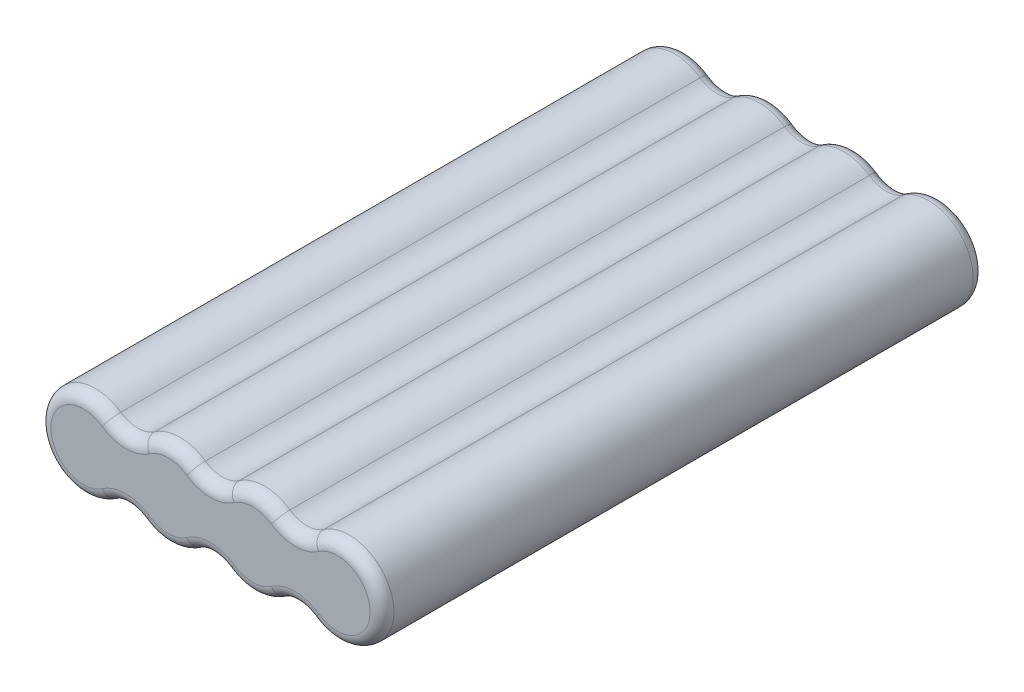
ISO-10303-21;
HEADER;
FILE_DESCRIPTION(('STEP AP214'),'2;1');
FILE_NAME('part.step','',(''),(''),'','','');
FILE_SCHEMA(('AUTOMOTIVE_DESIGN { 1 0 10303 214 1 1 1 1 }'));
ENDSEC;
DATA;
#1=APPLICATION_CONTEXT('core data for automotive mechanical design processes');
#2=APPLICATION_PROTOCOL_DEFINITION('international standard','automotive_design',2000,#1);
#3=PRODUCT_CONTEXT('',#1,'mechanical');
#4=PRODUCT('Part','Part','',(#3));
#5=PRODUCT_RELATED_PRODUCT_CATEGORY('part','',(#4));
#6=PRODUCT_DEFINITION_FORMATION('','',#4);
#7=PRODUCT_DEFINITION_CONTEXT('part definition',#1,'design');
#8=PRODUCT_DEFINITION('design','',#6,#7);
#9=PRODUCT_DEFINITION_SHAPE('','',#8);
#10=(LENGTH_UNIT() NAMED_UNIT(*) SI_UNIT(.MILLI.,.METRE.));
#11=(NAMED_UNIT(*) PLANE_ANGLE_UNIT() SI_UNIT($,.RADIAN.));
#12=(NAMED_UNIT(*) SI_UNIT($,.STERADIAN.) SOLID_ANGLE_UNIT());
#13=UNCERTAINTY_MEASURE_WITH_UNIT(LENGTH_MEASURE(1.E-05),#10,'distance_accuracy_value','');
#14=(GEOMETRIC_REPRESENTATION_CONTEXT(3) GLOBAL_UNCERTAINTY_ASSIGNED_CONTEXT((#13)) GLOBAL_UNIT_ASSIGNED_CONTEXT((#10,
#11,#12)) REPRESENTATION_CONTEXT('',''));
#15=CARTESIAN_POINT('',(0.,0.,0.));
#16=DIRECTION('',(0.,0.,1.));
#17=DIRECTION('',(1.,0.,0.));
#18=AXIS2_PLACEMENT_3D('',#15,#16,#17);
#19=CARTESIAN_POINT('',(14.2193333333333,-10.2811789153233,50.673));
#20=DIRECTION('',(0.,0.,-1.));
#21=DIRECTION('',(-1.,0.,0.));
#22=AXIS2_PLACEMENT_3D('',#19,#20,#21);
#23=CYLINDRICAL_SURFACE('',#22,5.);
#24=DIRECTION('',(0.,0.,-1.));
#25=VECTOR('',#24,1.);
#26=CARTESIAN_POINT('',(11.3754666666667,-6.16870734919399,50.673));
#27=LINE('',#26,#25);
#28=CARTESIAN_POINT('',(11.3754666666667,-6.16870734919399,48.673));
#29=VERTEX_POINT('',#28);
#30=CARTESIAN_POINT('',(11.3754666666667,-6.16870734919399,-48.673));
#31=VERTEX_POINT('',#30);
#32=EDGE_CURVE('E470',#29,#31,#27,.T.);
#33=ORIENTED_EDGE('',*,*,#32,.T.);
#34=CARTESIAN_POINT('',(14.2193333333333,-10.2811789153233,-48.673));
#35=DIRECTION('',(0.,0.,1.));
#36=DIRECTION('',(1.,0.,0.));
#37=AXIS2_PLACEMENT_3D('',#34,#35,#36);
#38=CIRCLE('',#37,5.);
#39=CARTESIAN_POINT('',(17.0632,-6.16870734919399,-48.673));
#40=VERTEX_POINT('',#39);
#41=EDGE_CURVE('E393',#31,#40,#38,.F.);
#42=ORIENTED_EDGE('',*,*,#41,.T.);
#43=DIRECTION('',(0.,0.,-1.));
#44=VECTOR('',#43,1.);
#45=CARTESIAN_POINT('',(17.0632,-6.16870734919399,50.673));
#46=LINE('',#45,#44);
#47=CARTESIAN_POINT('',(17.0632,-6.16870734919399,48.673));
#48=VERTEX_POINT('',#47);
#49=EDGE_CURVE('E273',#48,#40,#46,.T.);
#50=ORIENTED_EDGE('',*,*,#49,.F.);
#51=CARTESIAN_POINT('',(14.2193333333333,-10.2811789153233,48.673));
#52=DIRECTION('',(0.,0.,1.));
#53=DIRECTION('',(1.,0.,0.));
#54=AXIS2_PLACEMENT_3D('',#51,#52,#53);
#55=CIRCLE('',#54,5.);
#56=EDGE_CURVE('E391',#48,#29,#55,.T.);
#57=ORIENTED_EDGE('',*,*,#56,.T.);
#58=EDGE_LOOP('',(#33,#42,#50,#57));
#59=FACE_BOUND('',#58,.T.);
#60=ADVANCED_FACE('F44',(#59),#23,.F.);
#61=CARTESIAN_POINT('',(21.329,0.,50.673));
#62=DIRECTION('',(0.,0.,-1.));
#63=DIRECTION('',(-1.,0.,0.));
#64=AXIS2_PLACEMENT_3D('',#61,#62,#63);
#65=CYLINDRICAL_SURFACE('',#64,7.5);
#66=ORIENTED_EDGE('',*,*,#49,.T.);
#67=CARTESIAN_POINT('',(21.329,0.,-48.673));
#68=DIRECTION('',(0.,0.,1.));
#69=DIRECTION('',(1.,0.,0.));
#70=AXIS2_PLACEMENT_3D('',#67,#68,#69);
#71=CIRCLE('',#70,7.5);
#72=CARTESIAN_POINT('',(17.0632,6.168707349194,-48.673));
#73=VERTEX_POINT('',#72);
#74=EDGE_CURVE('E271',#40,#73,#71,.T.);
#75=ORIENTED_EDGE('',*,*,#74,.T.);
#76=DIRECTION('',(0.,0.,-1.));
#77=VECTOR('',#76,1.);
#78=CARTESIAN_POINT('',(17.0632,6.168707349194,50.673));
#79=LINE('',#78,#77);
#80=CARTESIAN_POINT('',(17.0632,6.168707349194,48.673));
#81=VERTEX_POINT('',#80);
#82=EDGE_CURVE('E252',#81,#73,#79,.T.);
#83=ORIENTED_EDGE('',*,*,#82,.F.);
#84=CARTESIAN_POINT('',(21.329,0.,48.673));
#85=DIRECTION('',(0.,0.,1.));
#86=DIRECTION('',(1.,0.,0.));
#87=AXIS2_PLACEMENT_3D('',#84,#85,#86);
#88=CIRCLE('',#87,7.5);
#89=EDGE_CURVE('E268',#81,#48,#88,.F.);
#90=ORIENTED_EDGE('',*,*,#89,.T.);
#91=EDGE_LOOP('',(#66,#75,#83,#90));
#92=FACE_BOUND('',#91,.T.);
#93=ADVANCED_FACE('F266',(#92),#65,.T.);
#94=CARTESIAN_POINT('',(14.2193333333333,10.2811789153233,50.673));
#95=DIRECTION('',(0.,0.,-1.));
#96=DIRECTION('',(-1.,0.,0.));
#97=AXIS2_PLACEMENT_3D('',#94,#95,#96);
#98=CYLINDRICAL_SURFACE('',#97,5.);
#99=ORIENTED_EDGE('',*,*,#82,.T.);
#100=CARTESIAN_POINT('',(14.2193333333333,10.2811789153233,-48.673));
#101=DIRECTION('',(0.,0.,1.));
#102=DIRECTION('',(1.,0.,0.));
#103=AXIS2_PLACEMENT_3D('',#100,#101,#102);
#104=CIRCLE('',#103,5.);
#105=CARTESIAN_POINT('',(11.3754666666667,6.168707349194,-48.673));
#106=VERTEX_POINT('',#105);
#107=EDGE_CURVE('E260',#73,#106,#104,.F.);
#108=ORIENTED_EDGE('',*,*,#107,.T.);
#109=DIRECTION('',(0.,0.,-1.));
#110=VECTOR('',#109,1.);
#111=CARTESIAN_POINT('',(11.3754666666667,6.168707349194,50.673));
#112=LINE('',#111,#110);
#113=CARTESIAN_POINT('',(11.3754666666667,6.168707349194,48.673));
#114=VERTEX_POINT('',#113);
#115=EDGE_CURVE('E254',#114,#106,#112,.T.);
#116=ORIENTED_EDGE('',*,*,#115,.F.);
#117=CARTESIAN_POINT('',(14.2193333333333,10.2811789153233,48.673));
#118=DIRECTION('',(0.,0.,1.));
#119=DIRECTION('',(1.,0.,0.));
#120=AXIS2_PLACEMENT_3D('',#117,#118,#119);
#121=CIRCLE('',#120,5.);
#122=EDGE_CURVE('E249',#114,#81,#121,.T.);
#123=ORIENTED_EDGE('',*,*,#122,.T.);
#124=EDGE_LOOP('',(#99,#108,#116,#123));
#125=FACE_BOUND('',#124,.T.);
#126=ADVANCED_FACE('F251',(#125),#98,.F.);
#127=CARTESIAN_POINT('',(7.10966666666667,0.,50.673));
#128=DIRECTION('',(0.,0.,-1.));
#129=DIRECTION('',(-1.,0.,0.));
#130=AXIS2_PLACEMENT_3D('',#127,#128,#129);
#131=CYLINDRICAL_SURFACE('',#130,7.5);
#132=ORIENTED_EDGE('',*,*,#115,.T.);
#133=CARTESIAN_POINT('',(7.10966666666667,0.,-48.673));
#134=DIRECTION('',(0.,0.,1.));
#135=DIRECTION('',(1.,0.,0.));
#136=AXIS2_PLACEMENT_3D('',#133,#134,#135);
#137=CIRCLE('',#136,7.5);
#138=CARTESIAN_POINT('',(2.84386666666667,6.168707349194,-48.673));
#139=VERTEX_POINT('',#138);
#140=EDGE_CURVE('E340',#106,#139,#137,.T.);
#141=ORIENTED_EDGE('',*,*,#140,.T.);
#142=DIRECTION('',(0.,0.,-1.));
#143=VECTOR('',#142,1.);
#144=CARTESIAN_POINT('',(2.84386666666667,6.168707349194,50.673));
#145=LINE('',#144,#143);
#146=CARTESIAN_POINT('',(2.84386666666667,6.168707349194,48.673));
#147=VERTEX_POINT('',#146);
#148=EDGE_CURVE('E530',#147,#139,#145,.T.);
#149=ORIENTED_EDGE('',*,*,#148,.F.);
#150=CARTESIAN_POINT('',(7.10966666666667,0.,48.673));
#151=DIRECTION('',(0.,0.,1.));
#152=DIRECTION('',(1.,0.,0.));
#153=AXIS2_PLACEMENT_3D('',#150,#151,#152);
#154=CIRCLE('',#153,7.5);
#155=EDGE_CURVE('E337',#147,#114,#154,.F.);
#156=ORIENTED_EDGE('',*,*,#155,.T.);
#157=EDGE_LOOP('',(#132,#141,#149,#156));
#158=FACE_BOUND('',#157,.T.);
#159=ADVANCED_FACE('F542',(#158),#131,.T.);
#160=CARTESIAN_POINT('',(0.,10.2811789153233,50.673));
#161=DIRECTION('',(0.,0.,-1.));
#162=DIRECTION('',(-1.,0.,0.));
#163=AXIS2_PLACEMENT_3D('',#160,#161,#162);
#164=CYLINDRICAL_SURFACE('',#163,5.);
#165=ORIENTED_EDGE('',*,*,#148,.T.);
#166=CARTESIAN_POINT('',(0.,10.2811789153233,-48.673));
#167=DIRECTION('',(0.,0.,1.));
#168=DIRECTION('',(1.,0.,0.));
#169=AXIS2_PLACEMENT_3D('',#166,#167,#168);
#170=CIRCLE('',#169,5.);
#171=CARTESIAN_POINT('',(-2.84386666666667,6.168707349194,-48.673));
#172=VERTEX_POINT('',#171);
#173=EDGE_CURVE('E346',#139,#172,#170,.F.);
#174=ORIENTED_EDGE('',*,*,#173,.T.);
#175=DIRECTION('',(0.,0.,-1.));
#176=VECTOR('',#175,1.);
#177=CARTESIAN_POINT('',(-2.84386666666667,6.168707349194,50.673));
#178=LINE('',#177,#176);
#179=CARTESIAN_POINT('',(-2.84386666666667,6.168707349194,48.673));
#180=VERTEX_POINT('',#179);
#181=EDGE_CURVE('E520',#180,#172,#178,.T.);
#182=ORIENTED_EDGE('',*,*,#181,.F.);
#183=CARTESIAN_POINT('',(0.,10.2811789153233,48.673));
#184=DIRECTION('',(0.,0.,1.));
#185=DIRECTION('',(1.,0.,0.));
#186=AXIS2_PLACEMENT_3D('',#183,#184,#185);
#187=CIRCLE('',#186,5.);
#188=EDGE_CURVE('E343',#180,#147,#187,.T.);
#189=ORIENTED_EDGE('',*,*,#188,.T.);
#190=EDGE_LOOP('',(#165,#174,#182,#189));
#191=FACE_BOUND('',#190,.T.);
#192=ADVANCED_FACE('F526',(#191),#164,.F.);
#193=CARTESIAN_POINT('',(-7.10966666666667,0.,50.673));
#194=DIRECTION('',(0.,0.,-1.));
#195=DIRECTION('',(-1.,0.,0.));
#196=AXIS2_PLACEMENT_3D('',#193,#194,#195);
#197=CYLINDRICAL_SURFACE('',#196,7.5);
#198=ORIENTED_EDGE('',*,*,#181,.T.);
#199=CARTESIAN_POINT('',(-7.10966666666667,0.,-48.673));
#200=DIRECTION('',(0.,0.,1.));
#201=DIRECTION('',(1.,0.,0.));
#202=AXIS2_PLACEMENT_3D('',#199,#200,#201);
#203=CIRCLE('',#202,7.5);
#204=CARTESIAN_POINT('',(-11.3754666666667,6.168707349194,-48.673));
#205=VERTEX_POINT('',#204);
#206=EDGE_CURVE('E352',#172,#205,#203,.T.);
#207=ORIENTED_EDGE('',*,*,#206,.T.);
#208=DIRECTION('',(0.,0.,-1.));
#209=VECTOR('',#208,1.);
#210=CARTESIAN_POINT('',(-11.3754666666667,6.168707349194,50.673));
#211=LINE('',#210,#209);
#212=CARTESIAN_POINT('',(-11.3754666666667,6.168707349194,48.673));
#213=VERTEX_POINT('',#212);
#214=EDGE_CURVE('E523',#213,#205,#211,.T.);
#215=ORIENTED_EDGE('',*,*,#214,.F.);
#216=CARTESIAN_POINT('',(-7.10966666666667,0.,48.673));
#217=DIRECTION('',(0.,0.,1.));
#218=DIRECTION('',(1.,0.,0.));
#219=AXIS2_PLACEMENT_3D('',#216,#217,#218);
#220=CIRCLE('',#219,7.5);
#221=EDGE_CURVE('E349',#213,#180,#220,.F.);
#222=ORIENTED_EDGE('',*,*,#221,.T.);
#223=EDGE_LOOP('',(#198,#207,#215,#222));
#224=FACE_BOUND('',#223,.T.);
#225=ADVANCED_FACE('F519',(#224),#197,.T.);
#226=CARTESIAN_POINT('',(-14.2193333333333,10.2811789153233,50.673));
#227=DIRECTION('',(0.,0.,-1.));
#228=DIRECTION('',(-1.,0.,0.));
#229=AXIS2_PLACEMENT_3D('',#226,#227,#228);
#230=CYLINDRICAL_SURFACE('',#229,5.);
#231=ORIENTED_EDGE('',*,*,#214,.T.);
#232=CARTESIAN_POINT('',(-14.2193333333333,10.2811789153233,-48.673));
#233=DIRECTION('',(0.,0.,1.));
#234=DIRECTION('',(1.,0.,0.));
#235=AXIS2_PLACEMENT_3D('',#232,#233,#234);
#236=CIRCLE('',#235,5.);
#237=CARTESIAN_POINT('',(-17.0632,6.168707349194,-48.673));
#238=VERTEX_POINT('',#237);
#239=EDGE_CURVE('E357',#205,#238,#236,.F.);
#240=ORIENTED_EDGE('',*,*,#239,.T.);
#241=DIRECTION('',(0.,0.,-1.));
#242=VECTOR('',#241,1.);
#243=CARTESIAN_POINT('',(-17.0632,6.168707349194,50.673));
#244=LINE('',#243,#242);
#245=CARTESIAN_POINT('',(-17.0632,6.168707349194,48.673));
#246=VERTEX_POINT('',#245);
#247=EDGE_CURVE('E535',#246,#238,#244,.T.);
#248=ORIENTED_EDGE('',*,*,#247,.F.);
#249=CARTESIAN_POINT('',(-14.2193333333333,10.2811789153233,48.673));
#250=DIRECTION('',(0.,0.,1.));
#251=DIRECTION('',(1.,0.,0.));
#252=AXIS2_PLACEMENT_3D('',#249,#250,#251);
#253=CIRCLE('',#252,5.);
#254=EDGE_CURVE('E355',#246,#213,#253,.T.);
#255=ORIENTED_EDGE('',*,*,#254,.T.);
#256=EDGE_LOOP('',(#231,#240,#248,#255));
#257=FACE_BOUND('',#256,.T.);
#258=ADVANCED_FACE('F938',(#257),#230,.F.);
#259=CARTESIAN_POINT('',(-21.329,0.,50.673));
#260=DIRECTION('',(0.,0.,-1.));
#261=DIRECTION('',(-1.,0.,0.));
#262=AXIS2_PLACEMENT_3D('',#259,#260,#261);
#263=CYLINDRICAL_SURFACE('',#262,7.5);
#264=ORIENTED_EDGE('',*,*,#247,.T.);
#265=CARTESIAN_POINT('',(-21.329,0.,-48.673));
#266=DIRECTION('',(0.,0.,1.));
#267=DIRECTION('',(1.,0.,0.));
#268=AXIS2_PLACEMENT_3D('',#265,#266,#267);
#269=CIRCLE('',#268,7.5);
#270=CARTESIAN_POINT('',(-17.0632,-6.16870734919399,-48.673));
#271=VERTEX_POINT('',#270);
#272=EDGE_CURVE('E363',#238,#271,#269,.T.);
#273=ORIENTED_EDGE('',*,*,#272,.T.);
#274=DIRECTION('',(0.,0.,-1.));
#275=VECTOR('',#274,1.);
#276=CARTESIAN_POINT('',(-17.0632,-6.16870734919399,50.673));
#277=LINE('',#276,#275);
#278=CARTESIAN_POINT('',(-17.0632,-6.16870734919399,48.673));
#279=VERTEX_POINT('',#278);
#280=EDGE_CURVE('E1034',#279,#271,#277,.T.);
#281=ORIENTED_EDGE('',*,*,#280,.F.);
#282=CARTESIAN_POINT('',(-21.329,0.,48.673));
#283=DIRECTION('',(0.,0.,1.));
#284=DIRECTION('',(1.,0.,0.));
#285=AXIS2_PLACEMENT_3D('',#282,#283,#284);
#286=CIRCLE('',#285,7.5);
#287=EDGE_CURVE('E360',#279,#246,#286,.F.);
#288=ORIENTED_EDGE('',*,*,#287,.T.);
#289=EDGE_LOOP('',(#264,#273,#281,#288));
#290=FACE_BOUND('',#289,.T.);
#291=ADVANCED_FACE('F928',(#290),#263,.T.);
#292=CARTESIAN_POINT('',(-14.2193333333333,-10.2811789153233,50.673));
#293=DIRECTION('',(0.,0.,-1.));
#294=DIRECTION('',(-1.,0.,0.));
#295=AXIS2_PLACEMENT_3D('',#292,#293,#294);
#296=CYLINDRICAL_SURFACE('',#295,5.);
#297=ORIENTED_EDGE('',*,*,#280,.T.);
#298=CARTESIAN_POINT('',(-14.2193333333333,-10.2811789153233,-48.673));
#299=DIRECTION('',(0.,0.,1.));
#300=DIRECTION('',(1.,0.,0.));
#301=AXIS2_PLACEMENT_3D('',#298,#299,#300);
#302=CIRCLE('',#301,5.);
#303=CARTESIAN_POINT('',(-11.3754666666667,-6.16870734919399,-48.673));
#304=VERTEX_POINT('',#303);
#305=EDGE_CURVE('E369',#271,#304,#302,.F.);
#306=ORIENTED_EDGE('',*,*,#305,.T.);
#307=DIRECTION('',(0.,0.,-1.));
#308=VECTOR('',#307,1.);
#309=CARTESIAN_POINT('',(-11.3754666666667,-6.16870734919399,50.673));
#310=LINE('',#309,#308);
#311=CARTESIAN_POINT('',(-11.3754666666667,-6.16870734919399,48.673));
#312=VERTEX_POINT('',#311);
#313=EDGE_CURVE('E1037',#312,#304,#310,.T.);
#314=ORIENTED_EDGE('',*,*,#313,.F.);
#315=CARTESIAN_POINT('',(-14.2193333333333,-10.2811789153233,48.673));
#316=DIRECTION('',(0.,0.,1.));
#317=DIRECTION('',(1.,0.,0.));
#318=AXIS2_PLACEMENT_3D('',#315,#316,#317);
#319=CIRCLE('',#318,5.);
#320=EDGE_CURVE('E366',#312,#279,#319,.T.);
#321=ORIENTED_EDGE('',*,*,#320,.T.);
#322=EDGE_LOOP('',(#297,#306,#314,#321));
#323=FACE_BOUND('',#322,.T.);
#324=ADVANCED_FACE('F918',(#323),#296,.F.);
#325=CARTESIAN_POINT('',(-7.10966666666667,0.,50.673));
#326=DIRECTION('',(0.,0.,-1.));
#327=DIRECTION('',(-1.,0.,0.));
#328=AXIS2_PLACEMENT_3D('',#325,#326,#327);
#329=CYLINDRICAL_SURFACE('',#328,7.5);
#330=ORIENTED_EDGE('',*,*,#313,.T.);
#331=CARTESIAN_POINT('',(-7.10966666666667,0.,-48.673));
#332=DIRECTION('',(0.,0.,1.));
#333=DIRECTION('',(1.,0.,0.));
#334=AXIS2_PLACEMENT_3D('',#331,#332,#333);
#335=CIRCLE('',#334,7.5);
#336=CARTESIAN_POINT('',(-2.84386666666667,-6.16870734919399,-48.673));
#337=VERTEX_POINT('',#336);
#338=EDGE_CURVE('E375',#304,#337,#335,.T.);
#339=ORIENTED_EDGE('',*,*,#338,.T.);
#340=DIRECTION('',(0.,0.,-1.));
#341=VECTOR('',#340,1.);
#342=CARTESIAN_POINT('',(-2.84386666666667,-6.16870734919399,50.673));
#343=LINE('',#342,#341);
#344=CARTESIAN_POINT('',(-2.84386666666667,-6.16870734919399,48.673));
#345=VERTEX_POINT('',#344);
#346=EDGE_CURVE('E1043',#345,#337,#343,.T.);
#347=ORIENTED_EDGE('',*,*,#346,.F.);
#348=CARTESIAN_POINT('',(-7.10966666666667,0.,48.673));
#349=DIRECTION('',(0.,0.,1.));
#350=DIRECTION('',(1.,0.,0.));
#351=AXIS2_PLACEMENT_3D('',#348,#349,#350);
#352=CIRCLE('',#351,7.5);
#353=EDGE_CURVE('E372',#345,#312,#352,.F.);
#354=ORIENTED_EDGE('',*,*,#353,.T.);
#355=EDGE_LOOP('',(#330,#339,#347,#354));
#356=FACE_BOUND('',#355,.T.);
#357=ADVANCED_FACE('F908',(#356),#329,.T.);
#358=CARTESIAN_POINT('',(0.,-10.2811789153233,50.673));
#359=DIRECTION('',(0.,0.,-1.));
#360=DIRECTION('',(-1.,0.,0.));
#361=AXIS2_PLACEMENT_3D('',#358,#359,#360);
#362=CYLINDRICAL_SURFACE('',#361,5.);
#363=ORIENTED_EDGE('',*,*,#346,.T.);
#364=CARTESIAN_POINT('',(0.,-10.2811789153233,-48.673));
#365=DIRECTION('',(0.,0.,1.));
#366=DIRECTION('',(1.,0.,0.));
#367=AXIS2_PLACEMENT_3D('',#364,#365,#366);
#368=CIRCLE('',#367,5.);
#369=CARTESIAN_POINT('',(2.84386666666666,-6.16870734919399,-48.673));
#370=VERTEX_POINT('',#369);
#371=EDGE_CURVE('E381',#337,#370,#368,.F.);
#372=ORIENTED_EDGE('',*,*,#371,.T.);
#373=DIRECTION('',(0.,0.,-1.));
#374=VECTOR('',#373,1.);
#375=CARTESIAN_POINT('',(2.84386666666666,-6.16870734919399,50.673));
#376=LINE('',#375,#374);
#377=CARTESIAN_POINT('',(2.84386666666666,-6.16870734919399,48.673));
#378=VERTEX_POINT('',#377);
#379=EDGE_CURVE('E1047',#378,#370,#376,.T.);
#380=ORIENTED_EDGE('',*,*,#379,.F.);
#381=CARTESIAN_POINT('',(0.,-10.2811789153233,48.673));
#382=DIRECTION('',(0.,0.,1.));
#383=DIRECTION('',(1.,0.,0.));
#384=AXIS2_PLACEMENT_3D('',#381,#382,#383);
#385=CIRCLE('',#384,5.);
#386=EDGE_CURVE('E378',#378,#345,#385,.T.);
#387=ORIENTED_EDGE('',*,*,#386,.T.);
#388=EDGE_LOOP('',(#363,#372,#380,#387));
#389=FACE_BOUND('',#388,.T.);
#390=ADVANCED_FACE('F898',(#389),#362,.F.);
#391=CARTESIAN_POINT('',(7.10966666666667,0.,50.673));
#392=DIRECTION('',(0.,0.,-1.));
#393=DIRECTION('',(-1.,0.,0.));
#394=AXIS2_PLACEMENT_3D('',#391,#392,#393);
#395=CYLINDRICAL_SURFACE('',#394,7.5);
#396=ORIENTED_EDGE('',*,*,#379,.T.);
#397=CARTESIAN_POINT('',(7.10966666666667,0.,-48.673));
#398=DIRECTION('',(0.,0.,1.));
#399=DIRECTION('',(1.,0.,0.));
#400=AXIS2_PLACEMENT_3D('',#397,#398,#399);
#401=CIRCLE('',#400,7.5);
#402=EDGE_CURVE('E388',#370,#31,#401,.T.);
#403=ORIENTED_EDGE('',*,*,#402,.T.);
#404=ORIENTED_EDGE('',*,*,#32,.F.);
#405=CARTESIAN_POINT('',(7.10966666666667,0.,48.673));
#406=DIRECTION('',(0.,0.,1.));
#407=DIRECTION('',(1.,0.,0.));
#408=AXIS2_PLACEMENT_3D('',#405,#406,#407);
#409=CIRCLE('',#408,7.5);
#410=EDGE_CURVE('E384',#29,#378,#409,.F.);
#411=ORIENTED_EDGE('',*,*,#410,.T.);
#412=EDGE_LOOP('',(#396,#403,#404,#411));
#413=FACE_BOUND('',#412,.T.);
#414=ADVANCED_FACE('F889',(#413),#395,.T.);
#415=CARTESIAN_POINT('',(10.6645,-5.14058945766166,50.673));
#416=DIRECTION('',(0.,0.,1.));
#417=DIRECTION('',(1.,0.,0.));
#418=AXIS2_PLACEMENT_3D('',#415,#416,#417);
#419=PLANE('',#418);
#420=CARTESIAN_POINT('',(0.,-10.2811789153233,50.673));
#421=DIRECTION('',(0.,0.,1.));
#422=DIRECTION('',(1.,0.,0.));
#423=AXIS2_PLACEMENT_3D('',#420,#421,#422);
#424=CIRCLE('',#423,7.);
#425=CARTESIAN_POINT('',(-3.98141333333334,-4.52371872274226,50.673));
#426=VERTEX_POINT('',#425);
#427=CARTESIAN_POINT('',(3.98141333333333,-4.52371872274226,50.673));
#428=VERTEX_POINT('',#427);
#429=EDGE_CURVE('E54',#426,#428,#424,.F.);
#430=ORIENTED_EDGE('',*,*,#429,.T.);
#431=CARTESIAN_POINT('',(7.10966666666667,0.,50.673));
#432=DIRECTION('',(0.,0.,1.));
#433=DIRECTION('',(1.,0.,0.));
#434=AXIS2_PLACEMENT_3D('',#431,#432,#433);
#435=CIRCLE('',#434,5.5);
#436=CARTESIAN_POINT('',(10.23792,-4.52371872274226,50.673));
#437=VERTEX_POINT('',#436);
#438=EDGE_CURVE('E11',#428,#437,#435,.T.);
#439=ORIENTED_EDGE('',*,*,#438,.T.);
#440=CARTESIAN_POINT('',(14.2193333333333,-10.2811789153233,50.673));
#441=DIRECTION('',(0.,0.,1.));
#442=DIRECTION('',(1.,0.,0.));
#443=AXIS2_PLACEMENT_3D('',#440,#441,#442);
#444=CIRCLE('',#443,7.);
#445=CARTESIAN_POINT('',(18.2007466666667,-4.52371872274226,50.673));
#446=VERTEX_POINT('',#445);
#447=EDGE_CURVE('E396',#437,#446,#444,.F.);
#448=ORIENTED_EDGE('',*,*,#447,.T.);
#449=CARTESIAN_POINT('',(21.329,0.,50.673));
#450=DIRECTION('',(0.,0.,1.));
#451=DIRECTION('',(1.,0.,0.));
#452=AXIS2_PLACEMENT_3D('',#449,#450,#451);
#453=CIRCLE('',#452,5.5);
#454=CARTESIAN_POINT('',(18.2007466666667,4.52371872274226,50.673));
#455=VERTEX_POINT('',#454);
#456=EDGE_CURVE('E399',#446,#455,#453,.T.);
#457=ORIENTED_EDGE('',*,*,#456,.T.);
#458=CARTESIAN_POINT('',(14.2193333333333,10.2811789153233,50.673));
#459=DIRECTION('',(0.,0.,1.));
#460=DIRECTION('',(1.,0.,0.));
#461=AXIS2_PLACEMENT_3D('',#458,#459,#460);
#462=CIRCLE('',#461,7.);
#463=CARTESIAN_POINT('',(10.23792,4.52371872274227,50.673));
#464=VERTEX_POINT('',#463);
#465=EDGE_CURVE('E279',#455,#464,#462,.F.);
#466=ORIENTED_EDGE('',*,*,#465,.T.);
#467=CARTESIAN_POINT('',(7.10966666666667,0.,50.673));
#468=DIRECTION('',(0.,0.,1.));
#469=DIRECTION('',(1.,0.,0.));
#470=AXIS2_PLACEMENT_3D('',#467,#468,#469);
#471=CIRCLE('',#470,5.5);
#472=CARTESIAN_POINT('',(3.98141333333333,4.52371872274227,50.673));
#473=VERTEX_POINT('',#472);
#474=EDGE_CURVE('E404',#464,#473,#471,.T.);
#475=ORIENTED_EDGE('',*,*,#474,.T.);
#476=CARTESIAN_POINT('',(0.,10.2811789153233,50.673));
#477=DIRECTION('',(0.,0.,1.));
#478=DIRECTION('',(1.,0.,0.));
#479=AXIS2_PLACEMENT_3D('',#476,#477,#478);
#480=CIRCLE('',#479,7.);
#481=CARTESIAN_POINT('',(-3.98141333333334,4.52371872274227,50.673));
#482=VERTEX_POINT('',#481);
#483=EDGE_CURVE('E407',#473,#482,#480,.F.);
#484=ORIENTED_EDGE('',*,*,#483,.T.);
#485=CARTESIAN_POINT('',(-7.10966666666667,0.,50.673));
#486=DIRECTION('',(0.,0.,1.));
#487=DIRECTION('',(1.,0.,0.));
#488=AXIS2_PLACEMENT_3D('',#485,#486,#487);
#489=CIRCLE('',#488,5.5);
#490=CARTESIAN_POINT('',(-10.23792,4.52371872274227,50.673));
#491=VERTEX_POINT('',#490);
#492=EDGE_CURVE('E410',#482,#491,#489,.T.);
#493=ORIENTED_EDGE('',*,*,#492,.T.);
#494=CARTESIAN_POINT('',(-14.2193333333333,10.2811789153233,50.673));
#495=DIRECTION('',(0.,0.,1.));
#496=DIRECTION('',(1.,0.,0.));
#497=AXIS2_PLACEMENT_3D('',#494,#495,#496);
#498=CIRCLE('',#497,7.);
#499=CARTESIAN_POINT('',(-18.2007466666667,4.52371872274227,50.673));
#500=VERTEX_POINT('',#499);
#501=EDGE_CURVE('E413',#491,#500,#498,.F.);
#502=ORIENTED_EDGE('',*,*,#501,.T.);
#503=CARTESIAN_POINT('',(-21.329,0.,50.673));
#504=DIRECTION('',(0.,0.,1.));
#505=DIRECTION('',(1.,0.,0.));
#506=AXIS2_PLACEMENT_3D('',#503,#504,#505);
#507=CIRCLE('',#506,5.5);
#508=CARTESIAN_POINT('',(-18.2007466666667,-4.52371872274226,50.673));
#509=VERTEX_POINT('',#508);
#510=EDGE_CURVE('E415',#500,#509,#507,.T.);
#511=ORIENTED_EDGE('',*,*,#510,.T.);
#512=CARTESIAN_POINT('',(-14.2193333333333,-10.2811789153233,50.673));
#513=DIRECTION('',(0.,0.,1.));
#514=DIRECTION('',(1.,0.,0.));
#515=AXIS2_PLACEMENT_3D('',#512,#513,#514);
#516=CIRCLE('',#515,7.);
#517=CARTESIAN_POINT('',(-10.23792,-4.52371872274226,50.673));
#518=VERTEX_POINT('',#517);
#519=EDGE_CURVE('E418',#509,#518,#516,.F.);
#520=ORIENTED_EDGE('',*,*,#519,.T.);
#521=CARTESIAN_POINT('',(-7.10966666666667,0.,50.673));
#522=DIRECTION('',(0.,0.,1.));
#523=DIRECTION('',(1.,0.,0.));
#524=AXIS2_PLACEMENT_3D('',#521,#522,#523);
#525=CIRCLE('',#524,5.5);
#526=EDGE_CURVE('E70',#518,#426,#525,.T.);
#527=ORIENTED_EDGE('',*,*,#526,.T.);
#528=EDGE_LOOP('',(#430,#439,#448,#457,#466,#475,#484,#493,#502,#511,#520,#527));
#529=FACE_BOUND('',#528,.T.);
#530=ADVANCED_FACE('F881',(#529),#419,.T.);
#531=CARTESIAN_POINT('',(10.6645,-5.14058945766166,-50.673));
#532=DIRECTION('',(0.,0.,1.));
#533=DIRECTION('',(1.,0.,0.));
#534=AXIS2_PLACEMENT_3D('',#531,#532,#533);
#535=PLANE('',#534);
#536=CARTESIAN_POINT('',(14.2193333333333,10.2811789153233,-50.673));
#537=DIRECTION('',(0.,0.,1.));
#538=DIRECTION('',(1.,0.,0.));
#539=AXIS2_PLACEMENT_3D('',#536,#537,#538);
#540=CIRCLE('',#539,7.);
#541=CARTESIAN_POINT('',(10.23792,4.52371872274227,-50.673));
#542=VERTEX_POINT('',#541);
#543=CARTESIAN_POINT('',(18.2007466666667,4.52371872274226,-50.673));
#544=VERTEX_POINT('',#543);
#545=EDGE_CURVE('E329',#542,#544,#540,.T.);
#546=ORIENTED_EDGE('',*,*,#545,.T.);
#547=CARTESIAN_POINT('',(21.329,0.,-50.673));
#548=DIRECTION('',(0.,0.,1.));
#549=DIRECTION('',(1.,0.,0.));
#550=AXIS2_PLACEMENT_3D('',#547,#548,#549);
#551=CIRCLE('',#550,5.5);
#552=CARTESIAN_POINT('',(18.2007466666667,-4.52371872274226,-50.673));
#553=VERTEX_POINT('',#552);
#554=EDGE_CURVE('E261',#544,#553,#551,.F.);
#555=ORIENTED_EDGE('',*,*,#554,.T.);
#556=CARTESIAN_POINT('',(14.2193333333333,-10.2811789153233,-50.673));
#557=DIRECTION('',(0.,0.,1.));
#558=DIRECTION('',(1.,0.,0.));
#559=AXIS2_PLACEMENT_3D('',#556,#557,#558);
#560=CIRCLE('',#559,7.);
#561=CARTESIAN_POINT('',(10.23792,-4.52371872274226,-50.673));
#562=VERTEX_POINT('',#561);
#563=EDGE_CURVE('E296',#553,#562,#560,.T.);
#564=ORIENTED_EDGE('',*,*,#563,.T.);
#565=CARTESIAN_POINT('',(7.10966666666667,0.,-50.673));
#566=DIRECTION('',(0.,0.,1.));
#567=DIRECTION('',(1.,0.,0.));
#568=AXIS2_PLACEMENT_3D('',#565,#566,#567);
#569=CIRCLE('',#568,5.5);
#570=CARTESIAN_POINT('',(3.98141333333333,-4.52371872274226,-50.673));
#571=VERTEX_POINT('',#570);
#572=EDGE_CURVE('E302',#562,#571,#569,.F.);
#573=ORIENTED_EDGE('',*,*,#572,.T.);
#574=CARTESIAN_POINT('',(0.,-10.2811789153233,-50.673));
#575=DIRECTION('',(0.,0.,1.));
#576=DIRECTION('',(1.,0.,0.));
#577=AXIS2_PLACEMENT_3D('',#574,#575,#576);
#578=CIRCLE('',#577,7.);
#579=CARTESIAN_POINT('',(-3.98141333333334,-4.52371872274226,-50.673));
#580=VERTEX_POINT('',#579);
#581=EDGE_CURVE('E305',#571,#580,#578,.T.);
#582=ORIENTED_EDGE('',*,*,#581,.T.);
#583=CARTESIAN_POINT('',(-7.10966666666667,0.,-50.673));
#584=DIRECTION('',(0.,0.,1.));
#585=DIRECTION('',(1.,0.,0.));
#586=AXIS2_PLACEMENT_3D('',#583,#584,#585);
#587=CIRCLE('',#586,5.5);
#588=CARTESIAN_POINT('',(-10.23792,-4.52371872274226,-50.673));
#589=VERTEX_POINT('',#588);
#590=EDGE_CURVE('E308',#580,#589,#587,.F.);
#591=ORIENTED_EDGE('',*,*,#590,.T.);
#592=CARTESIAN_POINT('',(-14.2193333333333,-10.2811789153233,-50.673));
#593=DIRECTION('',(0.,0.,1.));
#594=DIRECTION('',(1.,0.,0.));
#595=AXIS2_PLACEMENT_3D('',#592,#593,#594);
#596=CIRCLE('',#595,7.);
#597=CARTESIAN_POINT('',(-18.2007466666667,-4.52371872274226,-50.673));
#598=VERTEX_POINT('',#597);
#599=EDGE_CURVE('E311',#589,#598,#596,.T.);
#600=ORIENTED_EDGE('',*,*,#599,.T.);
#601=CARTESIAN_POINT('',(-21.329,0.,-50.673));
#602=DIRECTION('',(0.,0.,1.));
#603=DIRECTION('',(1.,0.,0.));
#604=AXIS2_PLACEMENT_3D('',#601,#602,#603);
#605=CIRCLE('',#604,5.5);
#606=CARTESIAN_POINT('',(-18.2007466666667,4.52371872274227,-50.673));
#607=VERTEX_POINT('',#606);
#608=EDGE_CURVE('E314',#598,#607,#605,.F.);
#609=ORIENTED_EDGE('',*,*,#608,.T.);
#610=CARTESIAN_POINT('',(-14.2193333333333,10.2811789153233,-50.673));
#611=DIRECTION('',(0.,0.,1.));
#612=DIRECTION('',(1.,0.,0.));
#613=AXIS2_PLACEMENT_3D('',#610,#611,#612);
#614=CIRCLE('',#613,7.);
#615=CARTESIAN_POINT('',(-10.23792,4.52371872274227,-50.673));
#616=VERTEX_POINT('',#615);
#617=EDGE_CURVE('E317',#607,#616,#614,.T.);
#618=ORIENTED_EDGE('',*,*,#617,.T.);
#619=CARTESIAN_POINT('',(-7.10966666666667,0.,-50.673));
#620=DIRECTION('',(0.,0.,1.));
#621=DIRECTION('',(1.,0.,0.));
#622=AXIS2_PLACEMENT_3D('',#619,#620,#621);
#623=CIRCLE('',#622,5.5);
#624=CARTESIAN_POINT('',(-3.98141333333334,4.52371872274227,-50.673));
#625=VERTEX_POINT('',#624);
#626=EDGE_CURVE('E320',#616,#625,#623,.F.);
#627=ORIENTED_EDGE('',*,*,#626,.T.);
#628=CARTESIAN_POINT('',(0.,10.2811789153233,-50.673));
#629=DIRECTION('',(0.,0.,1.));
#630=DIRECTION('',(1.,0.,0.));
#631=AXIS2_PLACEMENT_3D('',#628,#629,#630);
#632=CIRCLE('',#631,7.);
#633=CARTESIAN_POINT('',(3.98141333333333,4.52371872274227,-50.673));
#634=VERTEX_POINT('',#633);
#635=EDGE_CURVE('E323',#625,#634,#632,.T.);
#636=ORIENTED_EDGE('',*,*,#635,.T.);
#637=CARTESIAN_POINT('',(7.10966666666667,0.,-50.673));
#638=DIRECTION('',(0.,0.,1.));
#639=DIRECTION('',(1.,0.,0.));
#640=AXIS2_PLACEMENT_3D('',#637,#638,#639);
#641=CIRCLE('',#640,5.5);
#642=EDGE_CURVE('E326',#634,#542,#641,.F.);
#643=ORIENTED_EDGE('',*,*,#642,.T.);
#644=EDGE_LOOP('',(#546,#555,#564,#573,#582,#591,#600,#609,#618,#627,#636,#643));
#645=FACE_BOUND('',#644,.T.);
#646=ADVANCED_FACE('F556',(#645),#535,.F.);
#647=CARTESIAN_POINT('',(-21.329,0.,-48.673));
#648=DIRECTION('',(0.,0.,1.));
#649=DIRECTION('',(1.,0.,0.));
#650=AXIS2_PLACEMENT_3D('',#647,#648,#649);
#651=TOROIDAL_SURFACE('',#650,5.5,2.);
#652=CARTESIAN_POINT('',(-18.2007466666667,4.52371872274227,-48.673));
#653=DIRECTION('',(0.822494313225866,-0.568773333333333,0.));
#654=DIRECTION('',(0.568773333333333,0.822494313225866,0.));
#655=AXIS2_PLACEMENT_3D('',#652,#653,#654);
#656=CIRCLE('',#655,2.);
#657=EDGE_CURVE('E462',#607,#238,#656,.T.);
#658=ORIENTED_EDGE('',*,*,#657,.F.);
#659=ORIENTED_EDGE('',*,*,#608,.F.);
#660=CARTESIAN_POINT('',(-18.2007466666667,-4.52371872274226,-48.673));
#661=DIRECTION('',(0.822494313225866,0.568773333333333,0.));
#662=DIRECTION('',(-0.568773333333333,0.822494313225866,0.));
#663=AXIS2_PLACEMENT_3D('',#660,#661,#662);
#664=CIRCLE('',#663,2.);
#665=EDGE_CURVE('E466',#271,#598,#664,.T.);
#666=ORIENTED_EDGE('',*,*,#665,.F.);
#667=ORIENTED_EDGE('',*,*,#272,.F.);
#668=EDGE_LOOP('',(#658,#659,#666,#667));
#669=FACE_BOUND('',#668,.T.);
#670=ADVANCED_FACE('F588',(#669),#651,.T.);
#671=CARTESIAN_POINT('',(-14.2193333333333,-10.2811789153233,-48.673));
#672=DIRECTION('',(0.,0.,1.));
#673=DIRECTION('',(1.,0.,0.));
#674=AXIS2_PLACEMENT_3D('',#671,#672,#673);
#675=TOROIDAL_SURFACE('',#674,7.,2.);
#676=ORIENTED_EDGE('',*,*,#665,.T.);
#677=ORIENTED_EDGE('',*,*,#599,.F.);
#678=CARTESIAN_POINT('',(-10.23792,-4.52371872274226,-48.673));
#679=DIRECTION('',(0.822494313225866,-0.568773333333333,0.));
#680=DIRECTION('',(0.568773333333333,0.822494313225866,0.));
#681=AXIS2_PLACEMENT_3D('',#678,#679,#680);
#682=CIRCLE('',#681,2.);
#683=EDGE_CURVE('E458',#304,#589,#682,.T.);
#684=ORIENTED_EDGE('',*,*,#683,.F.);
#685=ORIENTED_EDGE('',*,*,#305,.F.);
#686=EDGE_LOOP('',(#676,#677,#684,#685));
#687=FACE_BOUND('',#686,.T.);
#688=ADVANCED_FACE('F583',(#687),#675,.T.);
#689=CARTESIAN_POINT('',(-14.2193333333333,10.2811789153233,-48.673));
#690=DIRECTION('',(0.,0.,1.));
#691=DIRECTION('',(1.,0.,0.));
#692=AXIS2_PLACEMENT_3D('',#689,#690,#691);
#693=TOROIDAL_SURFACE('',#692,7.,2.);
#694=ORIENTED_EDGE('',*,*,#657,.T.);
#695=ORIENTED_EDGE('',*,*,#239,.F.);
#696=CARTESIAN_POINT('',(-10.23792,4.52371872274227,-48.673));
#697=DIRECTION('',(0.822494313225866,0.568773333333333,0.));
#698=DIRECTION('',(-0.568773333333333,0.822494313225866,0.));
#699=AXIS2_PLACEMENT_3D('',#696,#697,#698);
#700=CIRCLE('',#699,2.);
#701=EDGE_CURVE('E454',#616,#205,#700,.T.);
#702=ORIENTED_EDGE('',*,*,#701,.F.);
#703=ORIENTED_EDGE('',*,*,#617,.F.);
#704=EDGE_LOOP('',(#694,#695,#702,#703));
#705=FACE_BOUND('',#704,.T.);
#706=ADVANCED_FACE('F594',(#705),#693,.T.);
#707=CARTESIAN_POINT('',(-7.10966666666667,0.,-48.673));
#708=DIRECTION('',(0.,0.,1.));
#709=DIRECTION('',(1.,0.,0.));
#710=AXIS2_PLACEMENT_3D('',#707,#708,#709);
#711=TOROIDAL_SURFACE('',#710,5.5,2.);
#712=ORIENTED_EDGE('',*,*,#683,.T.);
#713=ORIENTED_EDGE('',*,*,#590,.F.);
#714=CARTESIAN_POINT('',(-3.98141333333334,-4.52371872274226,-48.673));
#715=DIRECTION('',(0.822494313225866,0.568773333333333,0.));
#716=DIRECTION('',(-0.568773333333333,0.822494313225866,0.));
#717=AXIS2_PLACEMENT_3D('',#714,#715,#716);
#718=CIRCLE('',#717,2.);
#719=EDGE_CURVE('E450',#337,#580,#718,.T.);
#720=ORIENTED_EDGE('',*,*,#719,.F.);
#721=ORIENTED_EDGE('',*,*,#338,.F.);
#722=EDGE_LOOP('',(#712,#713,#720,#721));
#723=FACE_BOUND('',#722,.T.);
#724=ADVANCED_FACE('F578',(#723),#711,.T.);
#725=CARTESIAN_POINT('',(-7.10966666666667,0.,-48.673));
#726=DIRECTION('',(0.,0.,1.));
#727=DIRECTION('',(1.,0.,0.));
#728=AXIS2_PLACEMENT_3D('',#725,#726,#727);
#729=TOROIDAL_SURFACE('',#728,5.5,2.);
#730=ORIENTED_EDGE('',*,*,#701,.T.);
#731=ORIENTED_EDGE('',*,*,#206,.F.);
#732=CARTESIAN_POINT('',(-3.98141333333334,4.52371872274227,-48.673));
#733=DIRECTION('',(0.822494313225866,-0.568773333333334,0.));
#734=DIRECTION('',(0.568773333333334,0.822494313225866,0.));
#735=AXIS2_PLACEMENT_3D('',#732,#733,#734);
#736=CIRCLE('',#735,2.);
#737=EDGE_CURVE('E446',#625,#172,#736,.T.);
#738=ORIENTED_EDGE('',*,*,#737,.F.);
#739=ORIENTED_EDGE('',*,*,#626,.F.);
#740=EDGE_LOOP('',(#730,#731,#738,#739));
#741=FACE_BOUND('',#740,.T.);
#742=ADVANCED_FACE('F599',(#741),#729,.T.);
#743=CARTESIAN_POINT('',(0.,-10.2811789153233,-48.673));
#744=DIRECTION('',(0.,0.,1.));
#745=DIRECTION('',(1.,0.,0.));
#746=AXIS2_PLACEMENT_3D('',#743,#744,#745);
#747=TOROIDAL_SURFACE('',#746,7.,2.);
#748=ORIENTED_EDGE('',*,*,#719,.T.);
#749=ORIENTED_EDGE('',*,*,#581,.F.);
#750=CARTESIAN_POINT('',(3.98141333333333,-4.52371872274226,-48.673));
#751=DIRECTION('',(0.822494313225866,-0.568773333333334,0.));
#752=DIRECTION('',(0.568773333333334,0.822494313225866,0.));
#753=AXIS2_PLACEMENT_3D('',#750,#751,#752);
#754=CIRCLE('',#753,2.);
#755=EDGE_CURVE('E442',#370,#571,#754,.T.);
#756=ORIENTED_EDGE('',*,*,#755,.F.);
#757=ORIENTED_EDGE('',*,*,#371,.F.);
#758=EDGE_LOOP('',(#748,#749,#756,#757));
#759=FACE_BOUND('',#758,.T.);
#760=ADVANCED_FACE('F573',(#759),#747,.T.);
#761=CARTESIAN_POINT('',(0.,10.2811789153233,-48.673));
#762=DIRECTION('',(0.,0.,1.));
#763=DIRECTION('',(1.,0.,0.));
#764=AXIS2_PLACEMENT_3D('',#761,#762,#763);
#765=TOROIDAL_SURFACE('',#764,7.,2.);
#766=ORIENTED_EDGE('',*,*,#737,.T.);
#767=ORIENTED_EDGE('',*,*,#173,.F.);
#768=CARTESIAN_POINT('',(3.98141333333333,4.52371872274227,-48.673));
#769=DIRECTION('',(0.822494313225866,0.568773333333333,0.));
#770=DIRECTION('',(-0.568773333333333,0.822494313225866,0.));
#771=AXIS2_PLACEMENT_3D('',#768,#769,#770);
#772=CIRCLE('',#771,2.);
#773=EDGE_CURVE('E438',#634,#139,#772,.T.);
#774=ORIENTED_EDGE('',*,*,#773,.F.);
#775=ORIENTED_EDGE('',*,*,#635,.F.);
#776=EDGE_LOOP('',(#766,#767,#774,#775));
#777=FACE_BOUND('',#776,.T.);
#778=ADVANCED_FACE('F601',(#777),#765,.T.);
#779=CARTESIAN_POINT('',(7.10966666666667,0.,-48.673));
#780=DIRECTION('',(0.,0.,1.));
#781=DIRECTION('',(1.,0.,0.));
#782=AXIS2_PLACEMENT_3D('',#779,#780,#781);
#783=TOROIDAL_SURFACE('',#782,5.5,2.);
#784=ORIENTED_EDGE('',*,*,#755,.T.);
#785=ORIENTED_EDGE('',*,*,#572,.F.);
#786=CARTESIAN_POINT('',(10.23792,-4.52371872274226,-48.673));
#787=DIRECTION('',(0.822494313225866,0.568773333333333,0.));
#788=DIRECTION('',(-0.568773333333333,0.822494313225866,0.));
#789=AXIS2_PLACEMENT_3D('',#786,#787,#788);
#790=CIRCLE('',#789,2.);
#791=EDGE_CURVE('E434',#31,#562,#790,.T.);
#792=ORIENTED_EDGE('',*,*,#791,.F.);
#793=ORIENTED_EDGE('',*,*,#402,.F.);
#794=EDGE_LOOP('',(#784,#785,#792,#793));
#795=FACE_BOUND('',#794,.T.);
#796=ADVANCED_FACE('F568',(#795),#783,.T.);
#797=CARTESIAN_POINT('',(7.10966666666667,0.,-48.673));
#798=DIRECTION('',(0.,0.,1.));
#799=DIRECTION('',(1.,0.,0.));
#800=AXIS2_PLACEMENT_3D('',#797,#798,#799);
#801=TOROIDAL_SURFACE('',#800,5.5,2.);
#802=ORIENTED_EDGE('',*,*,#773,.T.);
#803=ORIENTED_EDGE('',*,*,#140,.F.);
#804=CARTESIAN_POINT('',(10.23792,4.52371872274227,-48.673));
#805=DIRECTION('',(0.822494313225865,-0.568773333333334,0.));
#806=DIRECTION('',(0.568773333333334,0.822494313225866,0.));
#807=AXIS2_PLACEMENT_3D('',#804,#805,#806);
#808=CIRCLE('',#807,2.);
#809=EDGE_CURVE('E430',#542,#106,#808,.T.);
#810=ORIENTED_EDGE('',*,*,#809,.F.);
#811=ORIENTED_EDGE('',*,*,#642,.F.);
#812=EDGE_LOOP('',(#802,#803,#810,#811));
#813=FACE_BOUND('',#812,.T.);
#814=ADVANCED_FACE('F546',(#813),#801,.T.);
#815=CARTESIAN_POINT('',(14.2193333333333,-10.2811789153233,-48.673));
#816=DIRECTION('',(0.,0.,1.));
#817=DIRECTION('',(1.,0.,0.));
#818=AXIS2_PLACEMENT_3D('',#815,#816,#817);
#819=TOROIDAL_SURFACE('',#818,7.,2.);
#820=ORIENTED_EDGE('',*,*,#791,.T.);
#821=ORIENTED_EDGE('',*,*,#563,.F.);
#822=CARTESIAN_POINT('',(18.2007466666667,-4.52371872274226,-48.673));
#823=DIRECTION('',(0.822494313225866,-0.568773333333333,0.));
#824=DIRECTION('',(0.568773333333333,0.822494313225866,0.));
#825=AXIS2_PLACEMENT_3D('',#822,#823,#824);
#826=CIRCLE('',#825,2.);
#827=EDGE_CURVE('E427',#40,#553,#826,.T.);
#828=ORIENTED_EDGE('',*,*,#827,.F.);
#829=ORIENTED_EDGE('',*,*,#41,.F.);
#830=EDGE_LOOP('',(#820,#821,#828,#829));
#831=FACE_BOUND('',#830,.T.);
#832=ADVANCED_FACE('F563',(#831),#819,.T.);
#833=CARTESIAN_POINT('',(14.2193333333333,10.2811789153233,-48.673));
#834=DIRECTION('',(0.,0.,1.));
#835=DIRECTION('',(1.,0.,0.));
#836=AXIS2_PLACEMENT_3D('',#833,#834,#835);
#837=TOROIDAL_SURFACE('',#836,7.,2.);
#838=ORIENTED_EDGE('',*,*,#809,.T.);
#839=ORIENTED_EDGE('',*,*,#107,.F.);
#840=CARTESIAN_POINT('',(18.2007466666667,4.52371872274226,-48.673));
#841=DIRECTION('',(0.822494313225866,0.568773333333333,0.));
#842=DIRECTION('',(-0.568773333333333,0.822494313225866,0.));
#843=AXIS2_PLACEMENT_3D('',#840,#841,#842);
#844=CIRCLE('',#843,2.);
#845=EDGE_CURVE('E425',#544,#73,#844,.T.);
#846=ORIENTED_EDGE('',*,*,#845,.F.);
#847=ORIENTED_EDGE('',*,*,#545,.F.);
#848=EDGE_LOOP('',(#838,#839,#846,#847));
#849=FACE_BOUND('',#848,.T.);
#850=ADVANCED_FACE('F552',(#849),#837,.T.);
#851=CARTESIAN_POINT('',(21.329,0.,-48.673));
#852=DIRECTION('',(0.,0.,1.));
#853=DIRECTION('',(1.,0.,0.));
#854=AXIS2_PLACEMENT_3D('',#851,#852,#853);
#855=TOROIDAL_SURFACE('',#854,5.5,2.);
#856=ORIENTED_EDGE('',*,*,#827,.T.);
#857=ORIENTED_EDGE('',*,*,#554,.F.);
#858=ORIENTED_EDGE('',*,*,#845,.T.);
#859=ORIENTED_EDGE('',*,*,#74,.F.);
#860=EDGE_LOOP('',(#856,#857,#858,#859));
#861=FACE_BOUND('',#860,.T.);
#862=ADVANCED_FACE('F558',(#861),#855,.T.);
#863=CARTESIAN_POINT('',(-7.10966666666667,0.,48.673));
#864=DIRECTION('',(0.,0.,1.));
#865=DIRECTION('',(1.,0.,0.));
#866=AXIS2_PLACEMENT_3D('',#863,#864,#865);
#867=TOROIDAL_SURFACE('',#866,5.5,2.);
#868=CARTESIAN_POINT('',(-3.98141333333334,4.52371872274227,48.673));
#869=DIRECTION('',(0.822494313225866,-0.568773333333333,0.));
#870=DIRECTION('',(0.568773333333333,0.822494313225866,0.));
#871=AXIS2_PLACEMENT_3D('',#868,#869,#870);
#872=CIRCLE('',#871,2.);
#873=EDGE_CURVE('E498',#180,#482,#872,.T.);
#874=ORIENTED_EDGE('',*,*,#873,.F.);
#875=ORIENTED_EDGE('',*,*,#221,.F.);
#876=CARTESIAN_POINT('',(-10.23792,4.52371872274227,48.673));
#877=DIRECTION('',(-0.822494313225866,-0.568773333333333,0.));
#878=DIRECTION('',(0.568773333333333,-0.822494313225866,0.));
#879=AXIS2_PLACEMENT_3D('',#876,#877,#878);
#880=CIRCLE('',#879,2.);
#881=EDGE_CURVE('E48',#491,#213,#880,.T.);
#882=ORIENTED_EDGE('',*,*,#881,.F.);
#883=ORIENTED_EDGE('',*,*,#492,.F.);
#884=EDGE_LOOP('',(#874,#875,#882,#883));
#885=FACE_BOUND('',#884,.T.);
#886=ADVANCED_FACE('F46',(#885),#867,.T.);
#887=CARTESIAN_POINT('',(-14.2193333333333,10.2811789153233,48.673));
#888=DIRECTION('',(0.,0.,1.));
#889=DIRECTION('',(1.,0.,0.));
#890=AXIS2_PLACEMENT_3D('',#887,#888,#889);
#891=TOROIDAL_SURFACE('',#890,7.,2.);
#892=ORIENTED_EDGE('',*,*,#881,.T.);
#893=ORIENTED_EDGE('',*,*,#254,.F.);
#894=CARTESIAN_POINT('',(-18.2007466666667,4.52371872274227,48.673));
#895=DIRECTION('',(-0.822494313225866,0.568773333333333,0.));
#896=DIRECTION('',(-0.568773333333333,-0.822494313225866,0.));
#897=AXIS2_PLACEMENT_3D('',#894,#895,#896);
#898=CIRCLE('',#897,2.);
#899=EDGE_CURVE('E496',#500,#246,#898,.T.);
#900=ORIENTED_EDGE('',*,*,#899,.F.);
#901=ORIENTED_EDGE('',*,*,#501,.F.);
#902=EDGE_LOOP('',(#892,#893,#900,#901));
#903=FACE_BOUND('',#902,.T.);
#904=ADVANCED_FACE('F510',(#903),#891,.T.);
#905=CARTESIAN_POINT('',(0.,10.2811789153233,48.673));
#906=DIRECTION('',(0.,0.,1.));
#907=DIRECTION('',(1.,0.,0.));
#908=AXIS2_PLACEMENT_3D('',#905,#906,#907);
#909=TOROIDAL_SURFACE('',#908,7.,2.);
#910=ORIENTED_EDGE('',*,*,#873,.T.);
#911=ORIENTED_EDGE('',*,*,#483,.F.);
#912=CARTESIAN_POINT('',(3.98141333333333,4.52371872274227,48.673));
#913=DIRECTION('',(0.822494313225865,0.568773333333334,0.));
#914=DIRECTION('',(-0.568773333333334,0.822494313225866,0.));
#915=AXIS2_PLACEMENT_3D('',#912,#913,#914);
#916=CIRCLE('',#915,2.);
#917=EDGE_CURVE('E492',#147,#473,#916,.T.);
#918=ORIENTED_EDGE('',*,*,#917,.F.);
#919=ORIENTED_EDGE('',*,*,#188,.F.);
#920=EDGE_LOOP('',(#910,#911,#918,#919));
#921=FACE_BOUND('',#920,.T.);
#922=ADVANCED_FACE('F654',(#921),#909,.T.);
#923=CARTESIAN_POINT('',(-21.329,0.,48.673));
#924=DIRECTION('',(0.,0.,1.));
#925=DIRECTION('',(1.,0.,0.));
#926=AXIS2_PLACEMENT_3D('',#923,#924,#925);
#927=TOROIDAL_SURFACE('',#926,5.5,2.);
#928=ORIENTED_EDGE('',*,*,#899,.T.);
#929=ORIENTED_EDGE('',*,*,#287,.F.);
#930=CARTESIAN_POINT('',(-18.2007466666667,-4.52371872274226,48.673));
#931=DIRECTION('',(0.822494313225866,0.568773333333333,0.));
#932=DIRECTION('',(-0.568773333333333,0.822494313225866,0.));
#933=AXIS2_PLACEMENT_3D('',#930,#931,#932);
#934=CIRCLE('',#933,2.);
#935=EDGE_CURVE('E488',#509,#279,#934,.T.);
#936=ORIENTED_EDGE('',*,*,#935,.F.);
#937=ORIENTED_EDGE('',*,*,#510,.F.);
#938=EDGE_LOOP('',(#928,#929,#936,#937));
#939=FACE_BOUND('',#938,.T.);
#940=ADVANCED_FACE('F660',(#939),#927,.T.);
#941=CARTESIAN_POINT('',(7.10966666666667,0.,48.673));
#942=DIRECTION('',(0.,0.,1.));
#943=DIRECTION('',(1.,0.,0.));
#944=AXIS2_PLACEMENT_3D('',#941,#942,#943);
#945=TOROIDAL_SURFACE('',#944,5.5,2.);
#946=ORIENTED_EDGE('',*,*,#917,.T.);
#947=ORIENTED_EDGE('',*,*,#474,.F.);
#948=CARTESIAN_POINT('',(10.23792,4.52371872274227,48.673));
#949=DIRECTION('',(0.822494313225866,-0.568773333333333,0.));
#950=DIRECTION('',(0.568773333333333,0.822494313225866,0.));
#951=AXIS2_PLACEMENT_3D('',#948,#949,#950);
#952=CIRCLE('',#951,2.);
#953=EDGE_CURVE('E485',#114,#464,#952,.T.);
#954=ORIENTED_EDGE('',*,*,#953,.F.);
#955=ORIENTED_EDGE('',*,*,#155,.F.);
#956=EDGE_LOOP('',(#946,#947,#954,#955));
#957=FACE_BOUND('',#956,.T.);
#958=ADVANCED_FACE('F667',(#957),#945,.T.);
#959=CARTESIAN_POINT('',(-14.2193333333333,-10.2811789153233,48.673));
#960=DIRECTION('',(0.,0.,1.));
#961=DIRECTION('',(1.,0.,0.));
#962=AXIS2_PLACEMENT_3D('',#959,#960,#961);
#963=TOROIDAL_SURFACE('',#962,7.,2.);
#964=ORIENTED_EDGE('',*,*,#935,.T.);
#965=ORIENTED_EDGE('',*,*,#320,.F.);
#966=CARTESIAN_POINT('',(-10.23792,-4.52371872274226,48.673));
#967=DIRECTION('',(0.822494313225866,-0.568773333333333,0.));
#968=DIRECTION('',(0.568773333333333,0.822494313225866,0.));
#969=AXIS2_PLACEMENT_3D('',#966,#967,#968);
#970=CIRCLE('',#969,2.);
#971=EDGE_CURVE('E283',#518,#312,#970,.T.);
#972=ORIENTED_EDGE('',*,*,#971,.F.);
#973=ORIENTED_EDGE('',*,*,#519,.F.);
#974=EDGE_LOOP('',(#964,#965,#972,#973));
#975=FACE_BOUND('',#974,.T.);
#976=ADVANCED_FACE('F675',(#975),#963,.T.);
#977=CARTESIAN_POINT('',(14.2193333333333,10.2811789153233,48.673));
#978=DIRECTION('',(0.,0.,1.));
#979=DIRECTION('',(1.,0.,0.));
#980=AXIS2_PLACEMENT_3D('',#977,#978,#979);
#981=TOROIDAL_SURFACE('',#980,7.,2.);
#982=ORIENTED_EDGE('',*,*,#953,.T.);
#983=ORIENTED_EDGE('',*,*,#465,.F.);
#984=CARTESIAN_POINT('',(18.2007466666667,4.52371872274226,48.673));
#985=DIRECTION('',(0.822494313225866,0.568773333333333,0.));
#986=DIRECTION('',(-0.568773333333333,0.822494313225866,0.));
#987=AXIS2_PLACEMENT_3D('',#984,#985,#986);
#988=CIRCLE('',#987,2.);
#989=EDGE_CURVE('E277',#81,#455,#988,.T.);
#990=ORIENTED_EDGE('',*,*,#989,.F.);
#991=ORIENTED_EDGE('',*,*,#122,.F.);
#992=EDGE_LOOP('',(#982,#983,#990,#991));
#993=FACE_BOUND('',#992,.T.);
#994=ADVANCED_FACE('F278',(#993),#981,.T.);
#995=CARTESIAN_POINT('',(-7.10966666666667,0.,48.673));
#996=DIRECTION('',(0.,0.,1.));
#997=DIRECTION('',(1.,0.,0.));
#998=AXIS2_PLACEMENT_3D('',#995,#996,#997);
#999=TOROIDAL_SURFACE('',#998,5.5,2.);
#1000=ORIENTED_EDGE('',*,*,#971,.T.);
#1001=ORIENTED_EDGE('',*,*,#353,.F.);
#1002=CARTESIAN_POINT('',(-3.98141333333334,-4.52371872274226,48.673));
#1003=DIRECTION('',(0.822494313225865,0.568773333333334,0.));
#1004=DIRECTION('',(-0.568773333333334,0.822494313225866,0.));
#1005=AXIS2_PLACEMENT_3D('',#1002,#1003,#1004);
#1006=CIRCLE('',#1005,2.);
#1007=EDGE_CURVE('E284',#426,#345,#1006,.T.);
#1008=ORIENTED_EDGE('',*,*,#1007,.F.);
#1009=ORIENTED_EDGE('',*,*,#526,.F.);
#1010=EDGE_LOOP('',(#1000,#1001,#1008,#1009));
#1011=FACE_BOUND('',#1010,.T.);
#1012=ADVANCED_FACE('F690',(#1011),#999,.T.);
#1013=CARTESIAN_POINT('',(21.329,0.,48.673));
#1014=DIRECTION('',(0.,0.,1.));
#1015=DIRECTION('',(1.,0.,0.));
#1016=AXIS2_PLACEMENT_3D('',#1013,#1014,#1015);
#1017=TOROIDAL_SURFACE('',#1016,5.5,2.);
#1018=ORIENTED_EDGE('',*,*,#989,.T.);
#1019=ORIENTED_EDGE('',*,*,#456,.F.);
#1020=CARTESIAN_POINT('',(18.2007466666667,-4.52371872274226,48.673));
#1021=DIRECTION('',(-0.822494313225866,0.568773333333333,0.));
#1022=DIRECTION('',(-0.568773333333333,-0.822494313225866,0.));
#1023=AXIS2_PLACEMENT_3D('',#1020,#1021,#1022);
#1024=CIRCLE('',#1023,2.);
#1025=EDGE_CURVE('E289',#48,#446,#1024,.T.);
#1026=ORIENTED_EDGE('',*,*,#1025,.F.);
#1027=ORIENTED_EDGE('',*,*,#89,.F.);
#1028=EDGE_LOOP('',(#1018,#1019,#1026,#1027));
#1029=FACE_BOUND('',#1028,.T.);
#1030=ADVANCED_FACE('F287',(#1029),#1017,.T.);
#1031=CARTESIAN_POINT('',(0.,-10.2811789153233,48.673));
#1032=DIRECTION('',(0.,0.,1.));
#1033=DIRECTION('',(1.,0.,0.));
#1034=AXIS2_PLACEMENT_3D('',#1031,#1032,#1033);
#1035=TOROIDAL_SURFACE('',#1034,7.,2.);
#1036=ORIENTED_EDGE('',*,*,#1007,.T.);
#1037=ORIENTED_EDGE('',*,*,#386,.F.);
#1038=CARTESIAN_POINT('',(3.98141333333333,-4.52371872274226,48.673));
#1039=DIRECTION('',(0.822494313225866,-0.568773333333334,0.));
#1040=DIRECTION('',(0.568773333333334,0.822494313225866,0.));
#1041=AXIS2_PLACEMENT_3D('',#1038,#1039,#1040);
#1042=CIRCLE('',#1041,2.);
#1043=EDGE_CURVE('E474',#428,#378,#1042,.T.);
#1044=ORIENTED_EDGE('',*,*,#1043,.F.);
#1045=ORIENTED_EDGE('',*,*,#429,.F.);
#1046=EDGE_LOOP('',(#1036,#1037,#1044,#1045));
#1047=FACE_BOUND('',#1046,.T.);
#1048=ADVANCED_FACE('F704',(#1047),#1035,.T.);
#1049=CARTESIAN_POINT('',(14.2193333333333,-10.2811789153233,48.673));
#1050=DIRECTION('',(0.,0.,1.));
#1051=DIRECTION('',(1.,0.,0.));
#1052=AXIS2_PLACEMENT_3D('',#1049,#1050,#1051);
#1053=TOROIDAL_SURFACE('',#1052,7.,2.);
#1054=ORIENTED_EDGE('',*,*,#1025,.T.);
#1055=ORIENTED_EDGE('',*,*,#447,.F.);
#1056=CARTESIAN_POINT('',(10.23792,-4.52371872274226,48.673));
#1057=DIRECTION('',(-0.822494313225865,-0.568773333333334,0.));
#1058=DIRECTION('',(0.568773333333334,-0.822494313225866,0.));
#1059=AXIS2_PLACEMENT_3D('',#1056,#1057,#1058);
#1060=CIRCLE('',#1059,2.);
#1061=EDGE_CURVE('E471',#29,#437,#1060,.T.);
#1062=ORIENTED_EDGE('',*,*,#1061,.F.);
#1063=ORIENTED_EDGE('',*,*,#56,.F.);
#1064=EDGE_LOOP('',(#1054,#1055,#1062,#1063));
#1065=FACE_BOUND('',#1064,.T.);
#1066=ADVANCED_FACE('F711',(#1065),#1053,.T.);
#1067=CARTESIAN_POINT('',(7.10966666666667,0.,48.673));
#1068=DIRECTION('',(0.,0.,1.));
#1069=DIRECTION('',(1.,0.,0.));
#1070=AXIS2_PLACEMENT_3D('',#1067,#1068,#1069);
#1071=TOROIDAL_SURFACE('',#1070,5.5,2.);
#1072=ORIENTED_EDGE('',*,*,#1043,.T.);
#1073=ORIENTED_EDGE('',*,*,#410,.F.);
#1074=ORIENTED_EDGE('',*,*,#1061,.T.);
#1075=ORIENTED_EDGE('',*,*,#438,.F.);
#1076=EDGE_LOOP('',(#1072,#1073,#1074,#1075));
#1077=FACE_BOUND('',#1076,.T.);
#1078=ADVANCED_FACE('F719',(#1077),#1071,.T.);
#1079=CLOSED_SHELL('',(#60,#93,#126,#159,#192,#225,#258,#291,#324,#357,#390,#414,#530,#646,#670,
#688,#706,#724,#742,#760,#778,#796,#814,#832,#850,#862,#886,#904,#922,#940,#958,#976,#994,#1012,
#1030,#1048,#1066,#1078));
#1080=MANIFOLD_SOLID_BREP('B2',#1079);
#1081=ADVANCED_BREP_SHAPE_REPRESENTATION('',(#18,#1080),#14);
#1082=SHAPE_DEFINITION_REPRESENTATION(#9,#1081);
ENDSEC;
END-ISO-10303-21;
